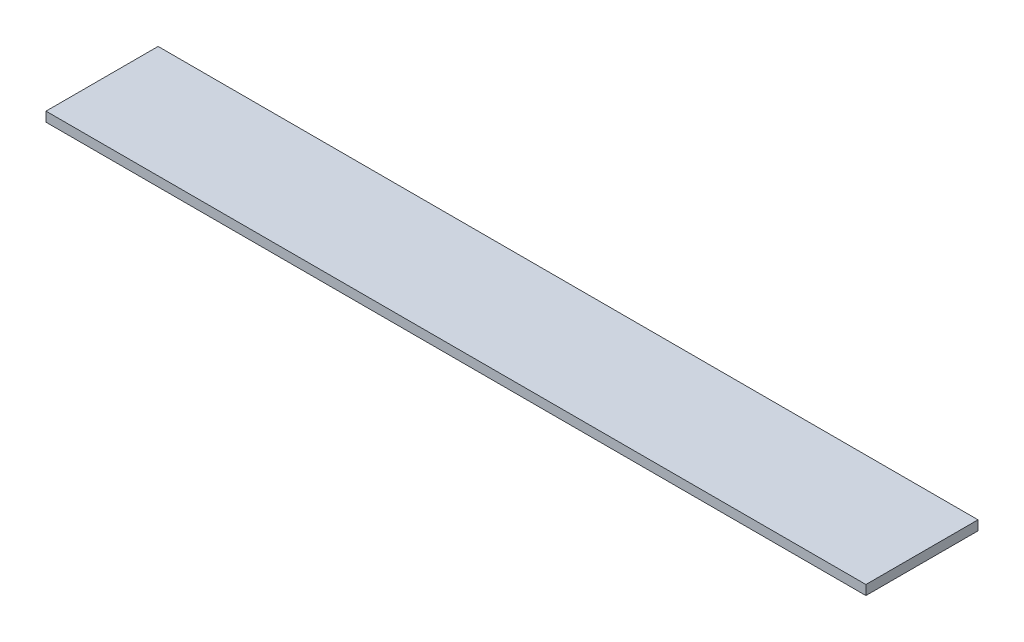
ISO-10303-21;
HEADER;
FILE_DESCRIPTION(('STEP AP214'),'2;1');
FILE_NAME('part.step','',(''),(''),'','','');
FILE_SCHEMA(('AUTOMOTIVE_DESIGN { 1 0 10303 214 1 1 1 1 }'));
ENDSEC;
DATA;
#1=APPLICATION_CONTEXT('core data for automotive mechanical design processes');
#2=APPLICATION_PROTOCOL_DEFINITION('international standard','automotive_design',2000,#1);
#3=PRODUCT_CONTEXT('',#1,'mechanical');
#4=PRODUCT('Part','Part','',(#3));
#5=PRODUCT_RELATED_PRODUCT_CATEGORY('part','',(#4));
#6=PRODUCT_DEFINITION_FORMATION('','',#4);
#7=PRODUCT_DEFINITION_CONTEXT('part definition',#1,'design');
#8=PRODUCT_DEFINITION('design','',#6,#7);
#9=PRODUCT_DEFINITION_SHAPE('','',#8);
#10=(LENGTH_UNIT() NAMED_UNIT(*) SI_UNIT(.MILLI.,.METRE.));
#11=(NAMED_UNIT(*) PLANE_ANGLE_UNIT() SI_UNIT($,.RADIAN.));
#12=(NAMED_UNIT(*) SI_UNIT($,.STERADIAN.) SOLID_ANGLE_UNIT());
#13=UNCERTAINTY_MEASURE_WITH_UNIT(LENGTH_MEASURE(1.E-05),#10,'distance_accuracy_value','');
#14=(GEOMETRIC_REPRESENTATION_CONTEXT(3) GLOBAL_UNCERTAINTY_ASSIGNED_CONTEXT((#13)) GLOBAL_UNIT_ASSIGNED_CONTEXT((#10,
#11,#12)) REPRESENTATION_CONTEXT('',''));
#15=CARTESIAN_POINT('',(0.,0.,0.));
#16=DIRECTION('',(0.,0.,1.));
#17=DIRECTION('',(1.,0.,0.));
#18=AXIS2_PLACEMENT_3D('',#15,#16,#17);
#19=CARTESIAN_POINT('',(-64.,1.5,8.75000000000001));
#20=DIRECTION('',(1.,0.,0.));
#21=DIRECTION('',(0.,0.,-1.));
#22=AXIS2_PLACEMENT_3D('',#19,#20,#21);
#23=PLANE('',#22);
#24=DIRECTION('',(0.,0.,1.));
#25=VECTOR('',#24,1.);
#26=CARTESIAN_POINT('',(-64.,0.,8.75000000000001));
#27=LINE('',#26,#25);
#28=CARTESIAN_POINT('',(-64.,0.,-8.74999999999999));
#29=VERTEX_POINT('',#28);
#30=CARTESIAN_POINT('',(-64.,0.,8.75000000000001));
#31=VERTEX_POINT('',#30);
#32=EDGE_CURVE('E107',#29,#31,#27,.T.);
#33=ORIENTED_EDGE('',*,*,#32,.T.);
#34=DIRECTION('',(0.,-1.,0.));
#35=VECTOR('',#34,1.);
#36=CARTESIAN_POINT('',(-64.,1.5,8.75000000000001));
#37=LINE('',#36,#35);
#38=CARTESIAN_POINT('',(-64.,1.5,8.75000000000001));
#39=VERTEX_POINT('',#38);
#40=EDGE_CURVE('E11',#39,#31,#37,.T.);
#41=ORIENTED_EDGE('',*,*,#40,.F.);
#42=DIRECTION('',(0.,0.,1.));
#43=VECTOR('',#42,1.);
#44=CARTESIAN_POINT('',(-64.,1.5,8.75000000000001));
#45=LINE('',#44,#43);
#46=CARTESIAN_POINT('',(-64.,1.5,-8.74999999999999));
#47=VERTEX_POINT('',#46);
#48=EDGE_CURVE('E91',#47,#39,#45,.T.);
#49=ORIENTED_EDGE('',*,*,#48,.F.);
#50=DIRECTION('',(0.,-1.,0.));
#51=VECTOR('',#50,1.);
#52=CARTESIAN_POINT('',(-64.,1.5,-8.74999999999999));
#53=LINE('',#52,#51);
#54=EDGE_CURVE('E103',#47,#29,#53,.T.);
#55=ORIENTED_EDGE('',*,*,#54,.T.);
#56=EDGE_LOOP('',(#33,#41,#49,#55));
#57=FACE_BOUND('',#56,.T.);
#58=ADVANCED_FACE('F39',(#57),#23,.F.);
#59=CARTESIAN_POINT('',(64.,1.5,8.74999999999999));
#60=DIRECTION('',(0.,0.,-1.));
#61=DIRECTION('',(-1.,0.,0.));
#62=AXIS2_PLACEMENT_3D('',#59,#60,#61);
#63=PLANE('',#62);
#64=DIRECTION('',(1.,0.,0.));
#65=VECTOR('',#64,1.);
#66=CARTESIAN_POINT('',(64.,0.,8.74999999999999));
#67=LINE('',#66,#65);
#68=CARTESIAN_POINT('',(64.,0.,8.74999999999999));
#69=VERTEX_POINT('',#68);
#70=EDGE_CURVE('E96',#31,#69,#67,.T.);
#71=ORIENTED_EDGE('',*,*,#70,.T.);
#72=DIRECTION('',(0.,-1.,0.));
#73=VECTOR('',#72,1.);
#74=CARTESIAN_POINT('',(64.,1.5,8.74999999999999));
#75=LINE('',#74,#73);
#76=CARTESIAN_POINT('',(64.,1.5,8.74999999999999));
#77=VERTEX_POINT('',#76);
#78=EDGE_CURVE('E48',#77,#69,#75,.T.);
#79=ORIENTED_EDGE('',*,*,#78,.F.);
#80=DIRECTION('',(1.,0.,0.));
#81=VECTOR('',#80,1.);
#82=CARTESIAN_POINT('',(64.,1.5,8.74999999999999));
#83=LINE('',#82,#81);
#84=EDGE_CURVE('E86',#39,#77,#83,.T.);
#85=ORIENTED_EDGE('',*,*,#84,.F.);
#86=ORIENTED_EDGE('',*,*,#40,.T.);
#87=EDGE_LOOP('',(#71,#79,#85,#86));
#88=FACE_BOUND('',#87,.T.);
#89=ADVANCED_FACE('F95',(#88),#63,.F.);
#90=CARTESIAN_POINT('',(64.,1.5,8.74999999999999));
#91=DIRECTION('',(-1.,0.,0.));
#92=DIRECTION('',(0.,0.,1.));
#93=AXIS2_PLACEMENT_3D('',#90,#91,#92);
#94=PLANE('',#93);
#95=DIRECTION('',(0.,0.,-1.));
#96=VECTOR('',#95,1.);
#97=CARTESIAN_POINT('',(64.,0.,8.74999999999999));
#98=LINE('',#97,#96);
#99=CARTESIAN_POINT('',(64.,0.,-8.75000000000001));
#100=VERTEX_POINT('',#99);
#101=EDGE_CURVE('E73',#69,#100,#98,.T.);
#102=ORIENTED_EDGE('',*,*,#101,.T.);
#103=DIRECTION('',(0.,-1.,0.));
#104=VECTOR('',#103,1.);
#105=CARTESIAN_POINT('',(64.,1.5,-8.75000000000001));
#106=LINE('',#105,#104);
#107=CARTESIAN_POINT('',(64.,1.5,-8.75000000000001));
#108=VERTEX_POINT('',#107);
#109=EDGE_CURVE('E98',#108,#100,#106,.T.);
#110=ORIENTED_EDGE('',*,*,#109,.F.);
#111=DIRECTION('',(0.,0.,-1.));
#112=VECTOR('',#111,1.);
#113=CARTESIAN_POINT('',(64.,1.5,8.74999999999999));
#114=LINE('',#113,#112);
#115=EDGE_CURVE('E89',#77,#108,#114,.T.);
#116=ORIENTED_EDGE('',*,*,#115,.F.);
#117=ORIENTED_EDGE('',*,*,#78,.T.);
#118=EDGE_LOOP('',(#102,#110,#116,#117));
#119=FACE_BOUND('',#118,.T.);
#120=ADVANCED_FACE('F99',(#119),#94,.F.);
#121=CARTESIAN_POINT('',(64.,1.5,-8.75000000000001));
#122=DIRECTION('',(0.,0.,1.));
#123=DIRECTION('',(1.,0.,0.));
#124=AXIS2_PLACEMENT_3D('',#121,#122,#123);
#125=PLANE('',#124);
#126=DIRECTION('',(-1.,0.,0.));
#127=VECTOR('',#126,1.);
#128=CARTESIAN_POINT('',(64.,0.,-8.75000000000001));
#129=LINE('',#128,#127);
#130=EDGE_CURVE('E79',#100,#29,#129,.T.);
#131=ORIENTED_EDGE('',*,*,#130,.T.);
#132=ORIENTED_EDGE('',*,*,#54,.F.);
#133=DIRECTION('',(-1.,0.,0.));
#134=VECTOR('',#133,1.);
#135=CARTESIAN_POINT('',(64.,1.5,-8.75000000000001));
#136=LINE('',#135,#134);
#137=EDGE_CURVE('E56',#108,#47,#136,.T.);
#138=ORIENTED_EDGE('',*,*,#137,.F.);
#139=ORIENTED_EDGE('',*,*,#109,.T.);
#140=EDGE_LOOP('',(#131,#132,#138,#139));
#141=FACE_BOUND('',#140,.T.);
#142=ADVANCED_FACE('F120',(#141),#125,.F.);
#143=CARTESIAN_POINT('',(0.,1.5,0.));
#144=DIRECTION('',(0.,1.,0.));
#145=DIRECTION('',(0.,0.,1.));
#146=AXIS2_PLACEMENT_3D('',#143,#144,#145);
#147=PLANE('',#146);
#148=ORIENTED_EDGE('',*,*,#48,.T.);
#149=ORIENTED_EDGE('',*,*,#84,.T.);
#150=ORIENTED_EDGE('',*,*,#115,.T.);
#151=ORIENTED_EDGE('',*,*,#137,.T.);
#152=EDGE_LOOP('',(#148,#149,#150,#151));
#153=FACE_BOUND('',#152,.T.);
#154=ADVANCED_FACE('F87',(#153),#147,.T.);
#155=CARTESIAN_POINT('',(0.,0.,0.));
#156=DIRECTION('',(0.,1.,0.));
#157=DIRECTION('',(0.,0.,1.));
#158=AXIS2_PLACEMENT_3D('',#155,#156,#157);
#159=PLANE('',#158);
#160=ORIENTED_EDGE('',*,*,#32,.F.);
#161=ORIENTED_EDGE('',*,*,#130,.F.);
#162=ORIENTED_EDGE('',*,*,#101,.F.);
#163=ORIENTED_EDGE('',*,*,#70,.F.);
#164=EDGE_LOOP('',(#160,#161,#162,#163));
#165=FACE_BOUND('',#164,.T.);
#166=ADVANCED_FACE('F123',(#165),#159,.F.);
#167=CLOSED_SHELL('',(#58,#89,#120,#142,#154,#166));
#168=MANIFOLD_SOLID_BREP('B2',#167);
#169=ADVANCED_BREP_SHAPE_REPRESENTATION('',(#18,#168),#14);
#170=SHAPE_DEFINITION_REPRESENTATION(#9,#169);
ENDSEC;
END-ISO-10303-21;
